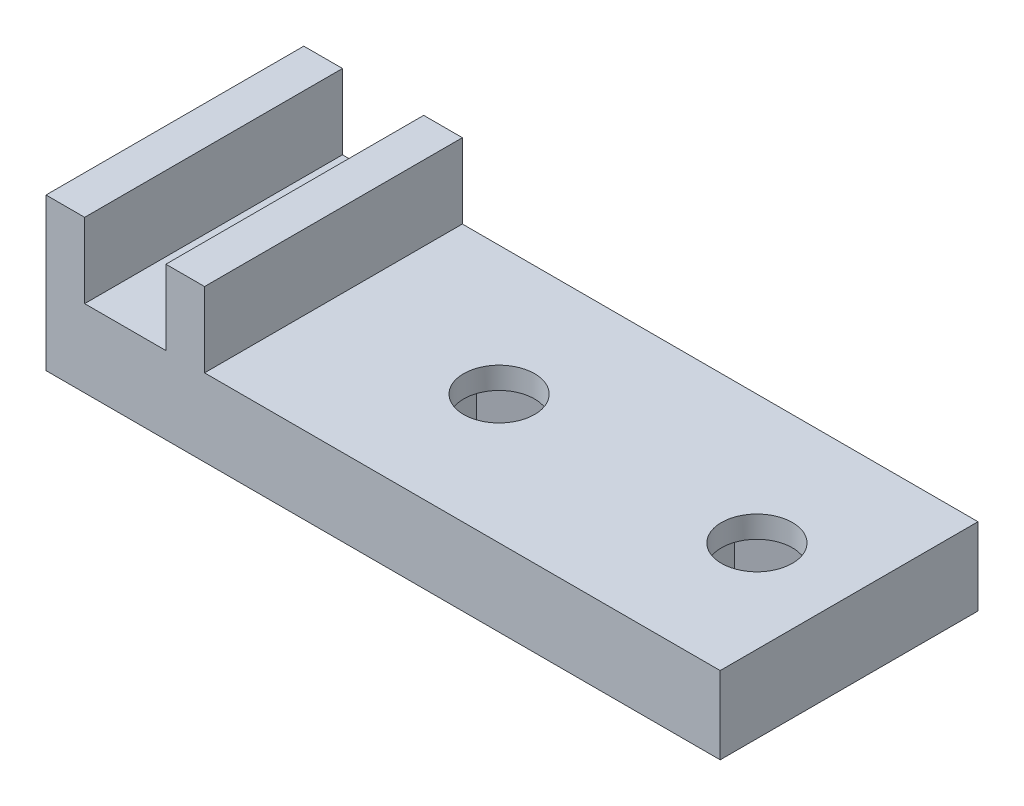
ISO-10303-21;
HEADER;
FILE_DESCRIPTION(('STEP AP214'),'2;1');
FILE_NAME('part.step','',(''),(''),'','','');
FILE_SCHEMA(('AUTOMOTIVE_DESIGN { 1 0 10303 214 1 1 1 1 }'));
ENDSEC;
DATA;
#1=APPLICATION_CONTEXT('core data for automotive mechanical design processes');
#2=APPLICATION_PROTOCOL_DEFINITION('international standard','automotive_design',2000,#1);
#3=PRODUCT_CONTEXT('',#1,'mechanical');
#4=PRODUCT('Part','Part','',(#3));
#5=PRODUCT_RELATED_PRODUCT_CATEGORY('part','',(#4));
#6=PRODUCT_DEFINITION_FORMATION('','',#4);
#7=PRODUCT_DEFINITION_CONTEXT('part definition',#1,'design');
#8=PRODUCT_DEFINITION('design','',#6,#7);
#9=PRODUCT_DEFINITION_SHAPE('','',#8);
#10=(LENGTH_UNIT() NAMED_UNIT(*) SI_UNIT(.MILLI.,.METRE.));
#11=(NAMED_UNIT(*) PLANE_ANGLE_UNIT() SI_UNIT($,.RADIAN.));
#12=(NAMED_UNIT(*) SI_UNIT($,.STERADIAN.) SOLID_ANGLE_UNIT());
#13=UNCERTAINTY_MEASURE_WITH_UNIT(LENGTH_MEASURE(1.E-05),#10,'distance_accuracy_value','');
#14=(GEOMETRIC_REPRESENTATION_CONTEXT(3) GLOBAL_UNCERTAINTY_ASSIGNED_CONTEXT((#13)) GLOBAL_UNIT_ASSIGNED_CONTEXT((#10,
#11,#12)) REPRESENTATION_CONTEXT('',''));
#15=CARTESIAN_POINT('',(0.,0.,0.));
#16=DIRECTION('',(0.,0.,1.));
#17=DIRECTION('',(1.,0.,0.));
#18=AXIS2_PLACEMENT_3D('',#15,#16,#17);
#19=CARTESIAN_POINT('',(-3.15,5.8,20.));
#20=DIRECTION('',(1.,0.,0.));
#21=DIRECTION('',(0.,0.,-1.));
#22=AXIS2_PLACEMENT_3D('',#19,#20,#21);
#23=PLANE('',#22);
#24=DIRECTION('',(0.,-1.,0.));
#25=VECTOR('',#24,1.);
#26=CARTESIAN_POINT('',(-3.15,5.8,0.));
#27=LINE('',#26,#25);
#28=CARTESIAN_POINT('',(-3.15,5.8,0.));
#29=VERTEX_POINT('',#28);
#30=CARTESIAN_POINT('',(-3.15,-6.,0.));
#31=VERTEX_POINT('',#30);
#32=EDGE_CURVE('E316',#29,#31,#27,.T.);
#33=ORIENTED_EDGE('',*,*,#32,.T.);
#34=DIRECTION('',(0.,0.,-1.));
#35=VECTOR('',#34,1.);
#36=CARTESIAN_POINT('',(-3.15,-6.,20.));
#37=LINE('',#36,#35);
#38=CARTESIAN_POINT('',(-3.15,-6.,20.));
#39=VERTEX_POINT('',#38);
#40=EDGE_CURVE('E11',#39,#31,#37,.T.);
#41=ORIENTED_EDGE('',*,*,#40,.F.);
#42=DIRECTION('',(0.,-1.,0.));
#43=VECTOR('',#42,1.);
#44=CARTESIAN_POINT('',(-3.15,5.8,20.));
#45=LINE('',#44,#43);
#46=CARTESIAN_POINT('',(-3.15,5.8,20.));
#47=VERTEX_POINT('',#46);
#48=EDGE_CURVE('E293',#47,#39,#45,.T.);
#49=ORIENTED_EDGE('',*,*,#48,.F.);
#50=DIRECTION('',(0.,0.,-1.));
#51=VECTOR('',#50,1.);
#52=CARTESIAN_POINT('',(-3.15,5.8,20.));
#53=LINE('',#52,#51);
#54=EDGE_CURVE('E315',#47,#29,#53,.T.);
#55=ORIENTED_EDGE('',*,*,#54,.T.);
#56=EDGE_LOOP('',(#33,#41,#49,#55));
#57=FACE_BOUND('',#56,.T.);
#58=ADVANCED_FACE('F41',(#57),#23,.F.);
#59=CARTESIAN_POINT('',(-3.15,-6.,20.));
#60=DIRECTION('',(0.,1.,0.));
#61=DIRECTION('',(0.,0.,1.));
#62=AXIS2_PLACEMENT_3D('',#59,#60,#61);
#63=PLANE('',#62);
#64=DIRECTION('',(0.,0.,-1.));
#65=VECTOR('',#64,1.);
#66=CARTESIAN_POINT('',(17.85,-6.,7.60399638286305));
#67=LINE('',#66,#65);
#68=CARTESIAN_POINT('',(17.85,-6.,12.3960036171369));
#69=VERTEX_POINT('',#68);
#70=CARTESIAN_POINT('',(17.85,-6.,7.60399638286305));
#71=VERTEX_POINT('',#70);
#72=EDGE_CURVE('E227',#69,#71,#67,.T.);
#73=ORIENTED_EDGE('',*,*,#72,.F.);
#74=DIRECTION('',(-0.866025403784439,0.,-0.5));
#75=VECTOR('',#74,1.);
#76=CARTESIAN_POINT('',(17.85,-6.,12.3960036171369));
#77=LINE('',#76,#75);
#78=CARTESIAN_POINT('',(22.,-6.,14.7920072342739));
#79=VERTEX_POINT('',#78);
#80=EDGE_CURVE('E57',#79,#69,#77,.T.);
#81=ORIENTED_EDGE('',*,*,#80,.F.);
#82=DIRECTION('',(-0.866025403784439,0.,0.5));
#83=VECTOR('',#82,1.);
#84=CARTESIAN_POINT('',(22.,-6.,14.7920072342739));
#85=LINE('',#84,#83);
#86=CARTESIAN_POINT('',(26.15,-6.,12.3960036171369));
#87=VERTEX_POINT('',#86);
#88=EDGE_CURVE('E213',#87,#79,#85,.T.);
#89=ORIENTED_EDGE('',*,*,#88,.F.);
#90=DIRECTION('',(0.,0.,1.));
#91=VECTOR('',#90,1.);
#92=CARTESIAN_POINT('',(26.15,-6.,12.3960036171369));
#93=LINE('',#92,#91);
#94=CARTESIAN_POINT('',(26.15,-6.,7.60399638286305));
#95=VERTEX_POINT('',#94);
#96=EDGE_CURVE('E216',#95,#87,#93,.T.);
#97=ORIENTED_EDGE('',*,*,#96,.F.);
#98=DIRECTION('',(0.866025403784439,0.,0.5));
#99=VECTOR('',#98,1.);
#100=CARTESIAN_POINT('',(26.15,-6.,7.60399638286305));
#101=LINE('',#100,#99);
#102=CARTESIAN_POINT('',(22.,-6.,5.20799276572611));
#103=VERTEX_POINT('',#102);
#104=EDGE_CURVE('E232',#103,#95,#101,.T.);
#105=ORIENTED_EDGE('',*,*,#104,.F.);
#106=DIRECTION('',(0.866025403784439,0.,-0.5));
#107=VECTOR('',#106,1.);
#108=CARTESIAN_POINT('',(22.,-6.,5.20799276572611));
#109=LINE('',#108,#107);
#110=EDGE_CURVE('E229',#71,#103,#109,.T.);
#111=ORIENTED_EDGE('',*,*,#110,.F.);
#112=EDGE_LOOP('',(#73,#81,#89,#97,#105,#111));
#113=FACE_BOUND('',#112,.T.);
#114=DIRECTION('',(0.,0.,-1.));
#115=VECTOR('',#114,1.);
#116=CARTESIAN_POINT('',(37.85,-6.,7.60399638286305));
#117=LINE('',#116,#115);
#118=CARTESIAN_POINT('',(37.85,-6.,12.3960036171369));
#119=VERTEX_POINT('',#118);
#120=CARTESIAN_POINT('',(37.85,-6.,7.60399638286305));
#121=VERTEX_POINT('',#120);
#122=EDGE_CURVE('E273',#119,#121,#117,.T.);
#123=ORIENTED_EDGE('',*,*,#122,.F.);
#124=DIRECTION('',(-0.866025403784439,0.,-0.5));
#125=VECTOR('',#124,1.);
#126=CARTESIAN_POINT('',(37.85,-6.,12.3960036171369));
#127=LINE('',#126,#125);
#128=CARTESIAN_POINT('',(42.,-6.,14.7920072342739));
#129=VERTEX_POINT('',#128);
#130=EDGE_CURVE('E65',#129,#119,#127,.T.);
#131=ORIENTED_EDGE('',*,*,#130,.F.);
#132=DIRECTION('',(-0.866025403784439,0.,0.5));
#133=VECTOR('',#132,1.);
#134=CARTESIAN_POINT('',(42.,-6.,14.7920072342739));
#135=LINE('',#134,#133);
#136=CARTESIAN_POINT('',(46.15,-6.,12.3960036171369));
#137=VERTEX_POINT('',#136);
#138=EDGE_CURVE('E260',#137,#129,#135,.T.);
#139=ORIENTED_EDGE('',*,*,#138,.F.);
#140=DIRECTION('',(0.,0.,1.));
#141=VECTOR('',#140,1.);
#142=CARTESIAN_POINT('',(46.15,-6.,12.3960036171369));
#143=LINE('',#142,#141);
#144=CARTESIAN_POINT('',(46.15,-6.,7.60399638286305));
#145=VERTEX_POINT('',#144);
#146=EDGE_CURVE('E263',#145,#137,#143,.T.);
#147=ORIENTED_EDGE('',*,*,#146,.F.);
#148=DIRECTION('',(0.866025403784439,0.,0.5));
#149=VECTOR('',#148,1.);
#150=CARTESIAN_POINT('',(46.15,-6.,7.60399638286305));
#151=LINE('',#150,#149);
#152=CARTESIAN_POINT('',(42.,-6.,5.20799276572611));
#153=VERTEX_POINT('',#152);
#154=EDGE_CURVE('E267',#153,#145,#151,.T.);
#155=ORIENTED_EDGE('',*,*,#154,.F.);
#156=DIRECTION('',(0.866025403784439,0.,-0.5));
#157=VECTOR('',#156,1.);
#158=CARTESIAN_POINT('',(42.,-6.,5.20799276572611));
#159=LINE('',#158,#157);
#160=EDGE_CURVE('E270',#121,#153,#159,.T.);
#161=ORIENTED_EDGE('',*,*,#160,.F.);
#162=EDGE_LOOP('',(#123,#131,#139,#147,#155,#161));
#163=FACE_BOUND('',#162,.T.);
#164=DIRECTION('',(1.,0.,0.));
#165=VECTOR('',#164,1.);
#166=CARTESIAN_POINT('',(-3.15,-6.,0.));
#167=LINE('',#166,#165);
#168=CARTESIAN_POINT('',(49.15,-6.,0.));
#169=VERTEX_POINT('',#168);
#170=EDGE_CURVE('E319',#31,#169,#167,.T.);
#171=ORIENTED_EDGE('',*,*,#170,.T.);
#172=DIRECTION('',(0.,0.,-1.));
#173=VECTOR('',#172,1.);
#174=CARTESIAN_POINT('',(49.15,-6.,20.));
#175=LINE('',#174,#173);
#176=CARTESIAN_POINT('',(49.15,-6.,20.));
#177=VERTEX_POINT('',#176);
#178=EDGE_CURVE('E49',#177,#169,#175,.T.);
#179=ORIENTED_EDGE('',*,*,#178,.F.);
#180=DIRECTION('',(1.,0.,0.));
#181=VECTOR('',#180,1.);
#182=CARTESIAN_POINT('',(-3.15,-6.,20.));
#183=LINE('',#182,#181);
#184=EDGE_CURVE('E296',#39,#177,#183,.T.);
#185=ORIENTED_EDGE('',*,*,#184,.F.);
#186=ORIENTED_EDGE('',*,*,#40,.T.);
#187=EDGE_LOOP('',(#171,#179,#185,#186));
#188=FACE_BOUND('',#187,.T.);
#189=ADVANCED_FACE('F391',(#113,#163,#188),#63,.F.);
#190=CARTESIAN_POINT('',(49.15,-6.,20.));
#191=DIRECTION('',(-1.,0.,0.));
#192=DIRECTION('',(0.,0.,1.));
#193=AXIS2_PLACEMENT_3D('',#190,#191,#192);
#194=PLANE('',#193);
#195=DIRECTION('',(0.,1.,0.));
#196=VECTOR('',#195,1.);
#197=CARTESIAN_POINT('',(49.15,-6.,0.));
#198=LINE('',#197,#196);
#199=CARTESIAN_POINT('',(49.15,0.,0.));
#200=VERTEX_POINT('',#199);
#201=EDGE_CURVE('E322',#169,#200,#198,.T.);
#202=ORIENTED_EDGE('',*,*,#201,.T.);
#203=DIRECTION('',(0.,0.,-1.));
#204=VECTOR('',#203,1.);
#205=CARTESIAN_POINT('',(49.15,0.,20.));
#206=LINE('',#205,#204);
#207=CARTESIAN_POINT('',(49.15,0.,20.));
#208=VERTEX_POINT('',#207);
#209=EDGE_CURVE('E357',#208,#200,#206,.T.);
#210=ORIENTED_EDGE('',*,*,#209,.F.);
#211=DIRECTION('',(0.,1.,0.));
#212=VECTOR('',#211,1.);
#213=CARTESIAN_POINT('',(49.15,-6.,20.));
#214=LINE('',#213,#212);
#215=EDGE_CURVE('E299',#177,#208,#214,.T.);
#216=ORIENTED_EDGE('',*,*,#215,.F.);
#217=ORIENTED_EDGE('',*,*,#178,.T.);
#218=EDGE_LOOP('',(#202,#210,#216,#217));
#219=FACE_BOUND('',#218,.T.);
#220=ADVANCED_FACE('F397',(#219),#194,.F.);
#221=CARTESIAN_POINT('',(49.15,0.,20.));
#222=DIRECTION('',(0.,-1.,0.));
#223=DIRECTION('',(0.,0.,-1.));
#224=AXIS2_PLACEMENT_3D('',#221,#222,#223);
#225=PLANE('',#224);
#226=CARTESIAN_POINT('',(22.,0.,10.));
#227=DIRECTION('',(0.,-1.,0.));
#228=DIRECTION('',(0.,0.,-1.));
#229=AXIS2_PLACEMENT_3D('',#226,#227,#228);
#230=CIRCLE('',#229,2.75);
#231=CARTESIAN_POINT('',(22.,0.,7.25));
#232=VERTEX_POINT('',#231);
#233=EDGE_CURVE('E320',#232,#232,#230,.T.);
#234=ORIENTED_EDGE('',*,*,#233,.T.);
#235=EDGE_LOOP('',(#234));
#236=FACE_BOUND('',#235,.T.);
#237=CARTESIAN_POINT('',(42.,0.,10.));
#238=DIRECTION('',(0.,-1.,0.));
#239=DIRECTION('',(0.,0.,-1.));
#240=AXIS2_PLACEMENT_3D('',#237,#238,#239);
#241=CIRCLE('',#240,2.75);
#242=CARTESIAN_POINT('',(42.,0.,7.25));
#243=VERTEX_POINT('',#242);
#244=EDGE_CURVE('E362',#243,#243,#241,.T.);
#245=ORIENTED_EDGE('',*,*,#244,.T.);
#246=EDGE_LOOP('',(#245));
#247=FACE_BOUND('',#246,.T.);
#248=DIRECTION('',(-1.,0.,0.));
#249=VECTOR('',#248,1.);
#250=CARTESIAN_POINT('',(49.15,0.,0.));
#251=LINE('',#250,#249);
#252=CARTESIAN_POINT('',(9.15,0.,0.));
#253=VERTEX_POINT('',#252);
#254=EDGE_CURVE('E324',#200,#253,#251,.T.);
#255=ORIENTED_EDGE('',*,*,#254,.T.);
#256=DIRECTION('',(0.,0.,-1.));
#257=VECTOR('',#256,1.);
#258=CARTESIAN_POINT('',(9.15,0.,20.));
#259=LINE('',#258,#257);
#260=CARTESIAN_POINT('',(9.15,0.,20.));
#261=VERTEX_POINT('',#260);
#262=EDGE_CURVE('E354',#261,#253,#259,.T.);
#263=ORIENTED_EDGE('',*,*,#262,.F.);
#264=DIRECTION('',(-1.,0.,0.));
#265=VECTOR('',#264,1.);
#266=CARTESIAN_POINT('',(49.15,0.,20.));
#267=LINE('',#266,#265);
#268=EDGE_CURVE('E301',#208,#261,#267,.T.);
#269=ORIENTED_EDGE('',*,*,#268,.F.);
#270=ORIENTED_EDGE('',*,*,#209,.T.);
#271=EDGE_LOOP('',(#255,#263,#269,#270));
#272=FACE_BOUND('',#271,.T.);
#273=ADVANCED_FACE('F444',(#236,#247,#272),#225,.F.);
#274=CARTESIAN_POINT('',(9.15,0.,20.));
#275=DIRECTION('',(-1.,0.,0.));
#276=DIRECTION('',(0.,0.,1.));
#277=AXIS2_PLACEMENT_3D('',#274,#275,#276);
#278=PLANE('',#277);
#279=DIRECTION('',(0.,1.,0.));
#280=VECTOR('',#279,1.);
#281=CARTESIAN_POINT('',(9.15,0.,0.));
#282=LINE('',#281,#280);
#283=CARTESIAN_POINT('',(9.15,5.8,0.));
#284=VERTEX_POINT('',#283);
#285=EDGE_CURVE('E326',#253,#284,#282,.T.);
#286=ORIENTED_EDGE('',*,*,#285,.T.);
#287=DIRECTION('',(0.,0.,-1.));
#288=VECTOR('',#287,1.);
#289=CARTESIAN_POINT('',(9.15,5.8,20.));
#290=LINE('',#289,#288);
#291=CARTESIAN_POINT('',(9.15,5.8,20.));
#292=VERTEX_POINT('',#291);
#293=EDGE_CURVE('E351',#292,#284,#290,.T.);
#294=ORIENTED_EDGE('',*,*,#293,.F.);
#295=DIRECTION('',(0.,1.,0.));
#296=VECTOR('',#295,1.);
#297=CARTESIAN_POINT('',(9.15,0.,20.));
#298=LINE('',#297,#296);
#299=EDGE_CURVE('E303',#261,#292,#298,.T.);
#300=ORIENTED_EDGE('',*,*,#299,.F.);
#301=ORIENTED_EDGE('',*,*,#262,.T.);
#302=EDGE_LOOP('',(#286,#294,#300,#301));
#303=FACE_BOUND('',#302,.T.);
#304=ADVANCED_FACE('F439',(#303),#278,.F.);
#305=CARTESIAN_POINT('',(9.15,5.8,20.));
#306=DIRECTION('',(0.,-1.,0.));
#307=DIRECTION('',(0.,0.,-1.));
#308=AXIS2_PLACEMENT_3D('',#305,#306,#307);
#309=PLANE('',#308);
#310=DIRECTION('',(-1.,0.,0.));
#311=VECTOR('',#310,1.);
#312=CARTESIAN_POINT('',(9.15,5.8,0.));
#313=LINE('',#312,#311);
#314=CARTESIAN_POINT('',(6.15,5.8,0.));
#315=VERTEX_POINT('',#314);
#316=EDGE_CURVE('E328',#284,#315,#313,.T.);
#317=ORIENTED_EDGE('',*,*,#316,.T.);
#318=DIRECTION('',(0.,0.,-1.));
#319=VECTOR('',#318,1.);
#320=CARTESIAN_POINT('',(6.15,5.8,20.));
#321=LINE('',#320,#319);
#322=CARTESIAN_POINT('',(6.15,5.8,20.));
#323=VERTEX_POINT('',#322);
#324=EDGE_CURVE('E348',#323,#315,#321,.T.);
#325=ORIENTED_EDGE('',*,*,#324,.F.);
#326=DIRECTION('',(-1.,0.,0.));
#327=VECTOR('',#326,1.);
#328=CARTESIAN_POINT('',(9.15,5.8,20.));
#329=LINE('',#328,#327);
#330=EDGE_CURVE('E305',#292,#323,#329,.T.);
#331=ORIENTED_EDGE('',*,*,#330,.F.);
#332=ORIENTED_EDGE('',*,*,#293,.T.);
#333=EDGE_LOOP('',(#317,#325,#331,#332));
#334=FACE_BOUND('',#333,.T.);
#335=ADVANCED_FACE('F435',(#334),#309,.F.);
#336=CARTESIAN_POINT('',(6.15,5.8,20.));
#337=DIRECTION('',(1.,0.,0.));
#338=DIRECTION('',(0.,0.,-1.));
#339=AXIS2_PLACEMENT_3D('',#336,#337,#338);
#340=PLANE('',#339);
#341=DIRECTION('',(0.,-1.,0.));
#342=VECTOR('',#341,1.);
#343=CARTESIAN_POINT('',(6.15,5.8,0.));
#344=LINE('',#343,#342);
#345=CARTESIAN_POINT('',(6.15,0.,0.));
#346=VERTEX_POINT('',#345);
#347=EDGE_CURVE('E330',#315,#346,#344,.T.);
#348=ORIENTED_EDGE('',*,*,#347,.T.);
#349=DIRECTION('',(0.,0.,-1.));
#350=VECTOR('',#349,1.);
#351=CARTESIAN_POINT('',(6.15,0.,20.));
#352=LINE('',#351,#350);
#353=CARTESIAN_POINT('',(6.15,0.,20.));
#354=VERTEX_POINT('',#353);
#355=EDGE_CURVE('E345',#354,#346,#352,.T.);
#356=ORIENTED_EDGE('',*,*,#355,.F.);
#357=DIRECTION('',(0.,-1.,0.));
#358=VECTOR('',#357,1.);
#359=CARTESIAN_POINT('',(6.15,5.8,20.));
#360=LINE('',#359,#358);
#361=EDGE_CURVE('E307',#323,#354,#360,.T.);
#362=ORIENTED_EDGE('',*,*,#361,.F.);
#363=ORIENTED_EDGE('',*,*,#324,.T.);
#364=EDGE_LOOP('',(#348,#356,#362,#363));
#365=FACE_BOUND('',#364,.T.);
#366=ADVANCED_FACE('F431',(#365),#340,.F.);
#367=CARTESIAN_POINT('',(6.15,0.,20.));
#368=DIRECTION('',(0.,-1.,0.));
#369=DIRECTION('',(0.,0.,-1.));
#370=AXIS2_PLACEMENT_3D('',#367,#368,#369);
#371=PLANE('',#370);
#372=DIRECTION('',(-1.,0.,0.));
#373=VECTOR('',#372,1.);
#374=CARTESIAN_POINT('',(6.15,0.,0.));
#375=LINE('',#374,#373);
#376=CARTESIAN_POINT('',(-0.15,0.,0.));
#377=VERTEX_POINT('',#376);
#378=EDGE_CURVE('E332',#346,#377,#375,.T.);
#379=ORIENTED_EDGE('',*,*,#378,.T.);
#380=DIRECTION('',(0.,0.,-1.));
#381=VECTOR('',#380,1.);
#382=CARTESIAN_POINT('',(-0.15,0.,20.));
#383=LINE('',#382,#381);
#384=CARTESIAN_POINT('',(-0.15,0.,20.));
#385=VERTEX_POINT('',#384);
#386=EDGE_CURVE('E342',#385,#377,#383,.T.);
#387=ORIENTED_EDGE('',*,*,#386,.F.);
#388=DIRECTION('',(-1.,0.,0.));
#389=VECTOR('',#388,1.);
#390=CARTESIAN_POINT('',(6.15,0.,20.));
#391=LINE('',#390,#389);
#392=EDGE_CURVE('E309',#354,#385,#391,.T.);
#393=ORIENTED_EDGE('',*,*,#392,.F.);
#394=ORIENTED_EDGE('',*,*,#355,.T.);
#395=EDGE_LOOP('',(#379,#387,#393,#394));
#396=FACE_BOUND('',#395,.T.);
#397=ADVANCED_FACE('F426',(#396),#371,.F.);
#398=CARTESIAN_POINT('',(-0.15,0.,20.));
#399=DIRECTION('',(-1.,0.,0.));
#400=DIRECTION('',(0.,0.,1.));
#401=AXIS2_PLACEMENT_3D('',#398,#399,#400);
#402=PLANE('',#401);
#403=DIRECTION('',(0.,1.,0.));
#404=VECTOR('',#403,1.);
#405=CARTESIAN_POINT('',(-0.15,0.,0.));
#406=LINE('',#405,#404);
#407=CARTESIAN_POINT('',(-0.15,5.8,0.));
#408=VERTEX_POINT('',#407);
#409=EDGE_CURVE('E334',#377,#408,#406,.T.);
#410=ORIENTED_EDGE('',*,*,#409,.T.);
#411=DIRECTION('',(0.,0.,-1.));
#412=VECTOR('',#411,1.);
#413=CARTESIAN_POINT('',(-0.15,5.8,20.));
#414=LINE('',#413,#412);
#415=CARTESIAN_POINT('',(-0.15,5.8,20.));
#416=VERTEX_POINT('',#415);
#417=EDGE_CURVE('E339',#416,#408,#414,.T.);
#418=ORIENTED_EDGE('',*,*,#417,.F.);
#419=DIRECTION('',(0.,1.,0.));
#420=VECTOR('',#419,1.);
#421=CARTESIAN_POINT('',(-0.15,0.,20.));
#422=LINE('',#421,#420);
#423=EDGE_CURVE('E311',#385,#416,#422,.T.);
#424=ORIENTED_EDGE('',*,*,#423,.F.);
#425=ORIENTED_EDGE('',*,*,#386,.T.);
#426=EDGE_LOOP('',(#410,#418,#424,#425));
#427=FACE_BOUND('',#426,.T.);
#428=ADVANCED_FACE('F420',(#427),#402,.F.);
#429=CARTESIAN_POINT('',(-0.15,5.8,20.));
#430=DIRECTION('',(0.,-1.,0.));
#431=DIRECTION('',(0.,0.,-1.));
#432=AXIS2_PLACEMENT_3D('',#429,#430,#431);
#433=PLANE('',#432);
#434=DIRECTION('',(-1.,0.,0.));
#435=VECTOR('',#434,1.);
#436=CARTESIAN_POINT('',(-0.15,5.8,0.));
#437=LINE('',#436,#435);
#438=EDGE_CURVE('E297',#408,#29,#437,.T.);
#439=ORIENTED_EDGE('',*,*,#438,.T.);
#440=ORIENTED_EDGE('',*,*,#54,.F.);
#441=DIRECTION('',(-1.,0.,0.));
#442=VECTOR('',#441,1.);
#443=CARTESIAN_POINT('',(-0.15,5.8,20.));
#444=LINE('',#443,#442);
#445=EDGE_CURVE('E313',#416,#47,#444,.T.);
#446=ORIENTED_EDGE('',*,*,#445,.F.);
#447=ORIENTED_EDGE('',*,*,#417,.T.);
#448=EDGE_LOOP('',(#439,#440,#446,#447));
#449=FACE_BOUND('',#448,.T.);
#450=ADVANCED_FACE('F418',(#449),#433,.F.);
#451=CARTESIAN_POINT('',(0.,0.,20.));
#452=DIRECTION('',(0.,0.,1.));
#453=DIRECTION('',(1.,0.,0.));
#454=AXIS2_PLACEMENT_3D('',#451,#452,#453);
#455=PLANE('',#454);
#456=ORIENTED_EDGE('',*,*,#48,.T.);
#457=ORIENTED_EDGE('',*,*,#184,.T.);
#458=ORIENTED_EDGE('',*,*,#215,.T.);
#459=ORIENTED_EDGE('',*,*,#268,.T.);
#460=ORIENTED_EDGE('',*,*,#299,.T.);
#461=ORIENTED_EDGE('',*,*,#330,.T.);
#462=ORIENTED_EDGE('',*,*,#361,.T.);
#463=ORIENTED_EDGE('',*,*,#392,.T.);
#464=ORIENTED_EDGE('',*,*,#423,.T.);
#465=ORIENTED_EDGE('',*,*,#445,.T.);
#466=EDGE_LOOP('',(#456,#457,#458,#459,#460,#461,#462,#463,#464,#465));
#467=FACE_BOUND('',#466,.T.);
#468=ADVANCED_FACE('F413',(#467),#455,.T.);
#469=CARTESIAN_POINT('',(0.,0.,0.));
#470=DIRECTION('',(0.,0.,1.));
#471=DIRECTION('',(1.,0.,0.));
#472=AXIS2_PLACEMENT_3D('',#469,#470,#471);
#473=PLANE('',#472);
#474=ORIENTED_EDGE('',*,*,#32,.F.);
#475=ORIENTED_EDGE('',*,*,#438,.F.);
#476=ORIENTED_EDGE('',*,*,#409,.F.);
#477=ORIENTED_EDGE('',*,*,#378,.F.);
#478=ORIENTED_EDGE('',*,*,#347,.F.);
#479=ORIENTED_EDGE('',*,*,#316,.F.);
#480=ORIENTED_EDGE('',*,*,#285,.F.);
#481=ORIENTED_EDGE('',*,*,#254,.F.);
#482=ORIENTED_EDGE('',*,*,#201,.F.);
#483=ORIENTED_EDGE('',*,*,#170,.F.);
#484=EDGE_LOOP('',(#474,#475,#476,#477,#478,#479,#480,#481,#482,#483));
#485=FACE_BOUND('',#484,.T.);
#486=ADVANCED_FACE('F405',(#485),#473,.F.);
#487=CARTESIAN_POINT('',(42.,-6.,10.));
#488=DIRECTION('',(0.,1.,0.));
#489=DIRECTION('',(0.,0.,1.));
#490=AXIS2_PLACEMENT_3D('',#487,#488,#489);
#491=CYLINDRICAL_SURFACE('',#490,2.75);
#492=CARTESIAN_POINT('',(42.,-1.7,10.));
#493=DIRECTION('',(0.,1.,0.));
#494=DIRECTION('',(0.,0.,1.));
#495=AXIS2_PLACEMENT_3D('',#492,#493,#494);
#496=CIRCLE('',#495,2.75);
#497=CARTESIAN_POINT('',(42.,-1.7,12.75));
#498=VERTEX_POINT('',#497);
#499=EDGE_CURVE('E44',#498,#498,#496,.F.);
#500=ORIENTED_EDGE('',*,*,#499,.T.);
#501=EDGE_LOOP('',(#500));
#502=FACE_BOUND('',#501,.T.);
#503=ORIENTED_EDGE('',*,*,#244,.F.);
#504=EDGE_LOOP('',(#503));
#505=FACE_BOUND('',#504,.T.);
#506=ADVANCED_FACE('F372',(#502,#505),#491,.F.);
#507=CARTESIAN_POINT('',(22.,-6.,10.));
#508=DIRECTION('',(0.,1.,0.));
#509=DIRECTION('',(0.,0.,1.));
#510=AXIS2_PLACEMENT_3D('',#507,#508,#509);
#511=CYLINDRICAL_SURFACE('',#510,2.75);
#512=CARTESIAN_POINT('',(22.,-1.7,10.));
#513=DIRECTION('',(0.,1.,0.));
#514=DIRECTION('',(0.,0.,1.));
#515=AXIS2_PLACEMENT_3D('',#512,#513,#514);
#516=CIRCLE('',#515,2.75);
#517=CARTESIAN_POINT('',(22.,-1.7,12.75));
#518=VERTEX_POINT('',#517);
#519=EDGE_CURVE('E239',#518,#518,#516,.F.);
#520=ORIENTED_EDGE('',*,*,#519,.T.);
#521=EDGE_LOOP('',(#520));
#522=FACE_BOUND('',#521,.T.);
#523=ORIENTED_EDGE('',*,*,#233,.F.);
#524=EDGE_LOOP('',(#523));
#525=FACE_BOUND('',#524,.T.);
#526=ADVANCED_FACE('F471',(#522,#525),#511,.F.);
#527=CARTESIAN_POINT('',(0.,-1.7,0.));
#528=DIRECTION('',(0.,1.,0.));
#529=DIRECTION('',(0.,0.,1.));
#530=AXIS2_PLACEMENT_3D('',#527,#528,#529);
#531=PLANE('',#530);
#532=DIRECTION('',(-0.866025403784439,0.,-0.5));
#533=VECTOR('',#532,1.);
#534=CARTESIAN_POINT('',(17.85,-1.7,12.3960036171369));
#535=LINE('',#534,#533);
#536=CARTESIAN_POINT('',(22.,-1.7,14.7920072342739));
#537=VERTEX_POINT('',#536);
#538=CARTESIAN_POINT('',(17.85,-1.7,12.3960036171369));
#539=VERTEX_POINT('',#538);
#540=EDGE_CURVE('E193',#537,#539,#535,.T.);
#541=ORIENTED_EDGE('',*,*,#540,.T.);
#542=DIRECTION('',(0.,0.,-1.));
#543=VECTOR('',#542,1.);
#544=CARTESIAN_POINT('',(17.85,-1.7,7.60399638286305));
#545=LINE('',#544,#543);
#546=CARTESIAN_POINT('',(17.85,-1.7,7.60399638286305));
#547=VERTEX_POINT('',#546);
#548=EDGE_CURVE('E202',#539,#547,#545,.T.);
#549=ORIENTED_EDGE('',*,*,#548,.T.);
#550=DIRECTION('',(0.866025403784439,0.,-0.5));
#551=VECTOR('',#550,1.);
#552=CARTESIAN_POINT('',(22.,-1.7,5.20799276572611));
#553=LINE('',#552,#551);
#554=CARTESIAN_POINT('',(22.,-1.7,5.20799276572611));
#555=VERTEX_POINT('',#554);
#556=EDGE_CURVE('E207',#547,#555,#553,.T.);
#557=ORIENTED_EDGE('',*,*,#556,.T.);
#558=DIRECTION('',(0.866025403784439,0.,0.5));
#559=VECTOR('',#558,1.);
#560=CARTESIAN_POINT('',(26.15,-1.7,7.60399638286305));
#561=LINE('',#560,#559);
#562=CARTESIAN_POINT('',(26.15,-1.7,7.60399638286305));
#563=VERTEX_POINT('',#562);
#564=EDGE_CURVE('E220',#555,#563,#561,.T.);
#565=ORIENTED_EDGE('',*,*,#564,.T.);
#566=DIRECTION('',(0.,0.,1.));
#567=VECTOR('',#566,1.);
#568=CARTESIAN_POINT('',(26.15,-1.7,12.3960036171369));
#569=LINE('',#568,#567);
#570=CARTESIAN_POINT('',(26.15,-1.7,12.3960036171369));
#571=VERTEX_POINT('',#570);
#572=EDGE_CURVE('E223',#563,#571,#569,.T.);
#573=ORIENTED_EDGE('',*,*,#572,.T.);
#574=DIRECTION('',(-0.866025403784439,0.,0.5));
#575=VECTOR('',#574,1.);
#576=CARTESIAN_POINT('',(22.,-1.7,14.7920072342739));
#577=LINE('',#576,#575);
#578=EDGE_CURVE('E199',#571,#537,#577,.T.);
#579=ORIENTED_EDGE('',*,*,#578,.T.);
#580=EDGE_LOOP('',(#541,#549,#557,#565,#573,#579));
#581=FACE_BOUND('',#580,.T.);
#582=ORIENTED_EDGE('',*,*,#519,.F.);
#583=EDGE_LOOP('',(#582));
#584=FACE_BOUND('',#583,.T.);
#585=ADVANCED_FACE('F209',(#581,#584),#531,.F.);
#586=CARTESIAN_POINT('',(17.85,-1.7,12.3960036171369));
#587=DIRECTION('',(-0.5,0.,0.866025403784439));
#588=DIRECTION('',(0.866025403784439,0.,0.5));
#589=AXIS2_PLACEMENT_3D('',#586,#587,#588);
#590=PLANE('',#589);
#591=ORIENTED_EDGE('',*,*,#80,.T.);
#592=DIRECTION('',(0.,-1.,0.));
#593=VECTOR('',#592,1.);
#594=CARTESIAN_POINT('',(17.85,-1.7,12.3960036171369));
#595=LINE('',#594,#593);
#596=EDGE_CURVE('E189',#539,#69,#595,.T.);
#597=ORIENTED_EDGE('',*,*,#596,.F.);
#598=ORIENTED_EDGE('',*,*,#540,.F.);
#599=DIRECTION('',(0.,-1.,0.));
#600=VECTOR('',#599,1.);
#601=CARTESIAN_POINT('',(22.,-1.7,14.7920072342739));
#602=LINE('',#601,#600);
#603=EDGE_CURVE('E237',#537,#79,#602,.T.);
#604=ORIENTED_EDGE('',*,*,#603,.T.);
#605=EDGE_LOOP('',(#591,#597,#598,#604));
#606=FACE_BOUND('',#605,.T.);
#607=ADVANCED_FACE('F191',(#606),#590,.F.);
#608=CARTESIAN_POINT('',(22.,-1.7,14.7920072342739));
#609=DIRECTION('',(0.5,0.,0.866025403784439));
#610=DIRECTION('',(0.866025403784439,0.,-0.5));
#611=AXIS2_PLACEMENT_3D('',#608,#609,#610);
#612=PLANE('',#611);
#613=ORIENTED_EDGE('',*,*,#88,.T.);
#614=ORIENTED_EDGE('',*,*,#603,.F.);
#615=ORIENTED_EDGE('',*,*,#578,.F.);
#616=DIRECTION('',(0.,-1.,0.));
#617=VECTOR('',#616,1.);
#618=CARTESIAN_POINT('',(26.15,-1.7,12.3960036171369));
#619=LINE('',#618,#617);
#620=EDGE_CURVE('E240',#571,#87,#619,.T.);
#621=ORIENTED_EDGE('',*,*,#620,.T.);
#622=EDGE_LOOP('',(#613,#614,#615,#621));
#623=FACE_BOUND('',#622,.T.);
#624=ADVANCED_FACE('F484',(#623),#612,.F.);
#625=CARTESIAN_POINT('',(26.15,-1.7,12.3960036171369));
#626=DIRECTION('',(1.,0.,0.));
#627=DIRECTION('',(0.,0.,-1.));
#628=AXIS2_PLACEMENT_3D('',#625,#626,#627);
#629=PLANE('',#628);
#630=ORIENTED_EDGE('',*,*,#96,.T.);
#631=ORIENTED_EDGE('',*,*,#620,.F.);
#632=ORIENTED_EDGE('',*,*,#572,.F.);
#633=DIRECTION('',(0.,-1.,0.));
#634=VECTOR('',#633,1.);
#635=CARTESIAN_POINT('',(26.15,-1.7,7.60399638286305));
#636=LINE('',#635,#634);
#637=EDGE_CURVE('E242',#563,#95,#636,.T.);
#638=ORIENTED_EDGE('',*,*,#637,.T.);
#639=EDGE_LOOP('',(#630,#631,#632,#638));
#640=FACE_BOUND('',#639,.T.);
#641=ADVANCED_FACE('F489',(#640),#629,.F.);
#642=CARTESIAN_POINT('',(26.15,-1.7,7.60399638286305));
#643=DIRECTION('',(0.5,0.,-0.866025403784439));
#644=DIRECTION('',(-0.866025403784439,0.,-0.5));
#645=AXIS2_PLACEMENT_3D('',#642,#643,#644);
#646=PLANE('',#645);
#647=ORIENTED_EDGE('',*,*,#104,.T.);
#648=ORIENTED_EDGE('',*,*,#637,.F.);
#649=ORIENTED_EDGE('',*,*,#564,.F.);
#650=DIRECTION('',(0.,-1.,0.));
#651=VECTOR('',#650,1.);
#652=CARTESIAN_POINT('',(22.,-1.7,5.20799276572611));
#653=LINE('',#652,#651);
#654=EDGE_CURVE('E244',#555,#103,#653,.T.);
#655=ORIENTED_EDGE('',*,*,#654,.T.);
#656=EDGE_LOOP('',(#647,#648,#649,#655));
#657=FACE_BOUND('',#656,.T.);
#658=ADVANCED_FACE('F493',(#657),#646,.F.);
#659=CARTESIAN_POINT('',(22.,-1.7,5.20799276572611));
#660=DIRECTION('',(-0.5,0.,-0.866025403784439));
#661=DIRECTION('',(-0.866025403784439,0.,0.5));
#662=AXIS2_PLACEMENT_3D('',#659,#660,#661);
#663=PLANE('',#662);
#664=ORIENTED_EDGE('',*,*,#110,.T.);
#665=ORIENTED_EDGE('',*,*,#654,.F.);
#666=ORIENTED_EDGE('',*,*,#556,.F.);
#667=DIRECTION('',(0.,-1.,0.));
#668=VECTOR('',#667,1.);
#669=CARTESIAN_POINT('',(17.85,-1.7,7.60399638286305));
#670=LINE('',#669,#668);
#671=EDGE_CURVE('E198',#547,#71,#670,.T.);
#672=ORIENTED_EDGE('',*,*,#671,.T.);
#673=EDGE_LOOP('',(#664,#665,#666,#672));
#674=FACE_BOUND('',#673,.T.);
#675=ADVANCED_FACE('F386',(#674),#663,.F.);
#676=CARTESIAN_POINT('',(17.85,-1.7,7.60399638286305));
#677=DIRECTION('',(-1.,0.,0.));
#678=DIRECTION('',(0.,0.,1.));
#679=AXIS2_PLACEMENT_3D('',#676,#677,#678);
#680=PLANE('',#679);
#681=ORIENTED_EDGE('',*,*,#72,.T.);
#682=ORIENTED_EDGE('',*,*,#671,.F.);
#683=ORIENTED_EDGE('',*,*,#548,.F.);
#684=ORIENTED_EDGE('',*,*,#596,.T.);
#685=EDGE_LOOP('',(#681,#682,#683,#684));
#686=FACE_BOUND('',#685,.T.);
#687=ADVANCED_FACE('F203',(#686),#680,.F.);
#688=CARTESIAN_POINT('',(0.,-1.7,0.));
#689=DIRECTION('',(0.,1.,0.));
#690=DIRECTION('',(0.,0.,1.));
#691=AXIS2_PLACEMENT_3D('',#688,#689,#690);
#692=PLANE('',#691);
#693=DIRECTION('',(-0.866025403784439,0.,-0.5));
#694=VECTOR('',#693,1.);
#695=CARTESIAN_POINT('',(37.85,-1.7,12.3960036171369));
#696=LINE('',#695,#694);
#697=CARTESIAN_POINT('',(42.,-1.7,14.7920072342739));
#698=VERTEX_POINT('',#697);
#699=CARTESIAN_POINT('',(37.85,-1.7,12.3960036171369));
#700=VERTEX_POINT('',#699);
#701=EDGE_CURVE('E264',#698,#700,#696,.T.);
#702=ORIENTED_EDGE('',*,*,#701,.T.);
#703=DIRECTION('',(0.,0.,-1.));
#704=VECTOR('',#703,1.);
#705=CARTESIAN_POINT('',(37.85,-1.7,7.60399638286305));
#706=LINE('',#705,#704);
#707=CARTESIAN_POINT('',(37.85,-1.7,7.60399638286305));
#708=VERTEX_POINT('',#707);
#709=EDGE_CURVE('E288',#700,#708,#706,.T.);
#710=ORIENTED_EDGE('',*,*,#709,.T.);
#711=DIRECTION('',(0.866025403784439,0.,-0.5));
#712=VECTOR('',#711,1.);
#713=CARTESIAN_POINT('',(42.,-1.7,5.20799276572611));
#714=LINE('',#713,#712);
#715=CARTESIAN_POINT('',(42.,-1.7,5.20799276572611));
#716=VERTEX_POINT('',#715);
#717=EDGE_CURVE('E285',#708,#716,#714,.T.);
#718=ORIENTED_EDGE('',*,*,#717,.T.);
#719=DIRECTION('',(0.866025403784439,0.,0.5));
#720=VECTOR('',#719,1.);
#721=CARTESIAN_POINT('',(46.15,-1.7,7.60399638286305));
#722=LINE('',#721,#720);
#723=CARTESIAN_POINT('',(46.15,-1.7,7.60399638286305));
#724=VERTEX_POINT('',#723);
#725=EDGE_CURVE('E282',#716,#724,#722,.T.);
#726=ORIENTED_EDGE('',*,*,#725,.T.);
#727=DIRECTION('',(0.,0.,1.));
#728=VECTOR('',#727,1.);
#729=CARTESIAN_POINT('',(46.15,-1.7,12.3960036171369));
#730=LINE('',#729,#728);
#731=CARTESIAN_POINT('',(46.15,-1.7,12.3960036171369));
#732=VERTEX_POINT('',#731);
#733=EDGE_CURVE('E279',#724,#732,#730,.T.);
#734=ORIENTED_EDGE('',*,*,#733,.T.);
#735=DIRECTION('',(-0.866025403784439,0.,0.5));
#736=VECTOR('',#735,1.);
#737=CARTESIAN_POINT('',(42.,-1.7,14.7920072342739));
#738=LINE('',#737,#736);
#739=EDGE_CURVE('E249',#732,#698,#738,.T.);
#740=ORIENTED_EDGE('',*,*,#739,.T.);
#741=EDGE_LOOP('',(#702,#710,#718,#726,#734,#740));
#742=FACE_BOUND('',#741,.T.);
#743=ORIENTED_EDGE('',*,*,#499,.F.);
#744=EDGE_LOOP('',(#743));
#745=FACE_BOUND('',#744,.T.);
#746=ADVANCED_FACE('F375',(#742,#745),#692,.F.);
#747=CARTESIAN_POINT('',(37.85,-1.7,12.3960036171369));
#748=DIRECTION('',(-0.5,0.,0.866025403784439));
#749=DIRECTION('',(0.866025403784439,0.,0.5));
#750=AXIS2_PLACEMENT_3D('',#747,#748,#749);
#751=PLANE('',#750);
#752=ORIENTED_EDGE('',*,*,#130,.T.);
#753=DIRECTION('',(0.,-1.,0.));
#754=VECTOR('',#753,1.);
#755=CARTESIAN_POINT('',(37.85,-1.7,12.3960036171369));
#756=LINE('',#755,#754);
#757=EDGE_CURVE('E247',#700,#119,#756,.T.);
#758=ORIENTED_EDGE('',*,*,#757,.F.);
#759=ORIENTED_EDGE('',*,*,#701,.F.);
#760=DIRECTION('',(0.,-1.,0.));
#761=VECTOR('',#760,1.);
#762=CARTESIAN_POINT('',(42.,-1.7,14.7920072342739));
#763=LINE('',#762,#761);
#764=EDGE_CURVE('E258',#698,#129,#763,.T.);
#765=ORIENTED_EDGE('',*,*,#764,.T.);
#766=EDGE_LOOP('',(#752,#758,#759,#765));
#767=FACE_BOUND('',#766,.T.);
#768=ADVANCED_FACE('F377',(#767),#751,.F.);
#769=CARTESIAN_POINT('',(42.,-1.7,14.7920072342739));
#770=DIRECTION('',(0.5,0.,0.866025403784439));
#771=DIRECTION('',(0.866025403784439,0.,-0.5));
#772=AXIS2_PLACEMENT_3D('',#769,#770,#771);
#773=PLANE('',#772);
#774=ORIENTED_EDGE('',*,*,#138,.T.);
#775=ORIENTED_EDGE('',*,*,#764,.F.);
#776=ORIENTED_EDGE('',*,*,#739,.F.);
#777=DIRECTION('',(0.,-1.,0.));
#778=VECTOR('',#777,1.);
#779=CARTESIAN_POINT('',(46.15,-1.7,12.3960036171369));
#780=LINE('',#779,#778);
#781=EDGE_CURVE('E256',#732,#137,#780,.T.);
#782=ORIENTED_EDGE('',*,*,#781,.T.);
#783=EDGE_LOOP('',(#774,#775,#776,#782));
#784=FACE_BOUND('',#783,.T.);
#785=ADVANCED_FACE('F384',(#784),#773,.F.);
#786=CARTESIAN_POINT('',(46.15,-1.7,12.3960036171369));
#787=DIRECTION('',(1.,0.,0.));
#788=DIRECTION('',(0.,0.,-1.));
#789=AXIS2_PLACEMENT_3D('',#786,#787,#788);
#790=PLANE('',#789);
#791=ORIENTED_EDGE('',*,*,#146,.T.);
#792=ORIENTED_EDGE('',*,*,#781,.F.);
#793=ORIENTED_EDGE('',*,*,#733,.F.);
#794=DIRECTION('',(0.,-1.,0.));
#795=VECTOR('',#794,1.);
#796=CARTESIAN_POINT('',(46.15,-1.7,7.60399638286305));
#797=LINE('',#796,#795);
#798=EDGE_CURVE('E254',#724,#145,#797,.T.);
#799=ORIENTED_EDGE('',*,*,#798,.T.);
#800=EDGE_LOOP('',(#791,#792,#793,#799));
#801=FACE_BOUND('',#800,.T.);
#802=ADVANCED_FACE('F512',(#801),#790,.F.);
#803=CARTESIAN_POINT('',(46.15,-1.7,7.60399638286305));
#804=DIRECTION('',(0.5,0.,-0.866025403784439));
#805=DIRECTION('',(-0.866025403784439,0.,-0.5));
#806=AXIS2_PLACEMENT_3D('',#803,#804,#805);
#807=PLANE('',#806);
#808=ORIENTED_EDGE('',*,*,#154,.T.);
#809=ORIENTED_EDGE('',*,*,#798,.F.);
#810=ORIENTED_EDGE('',*,*,#725,.F.);
#811=DIRECTION('',(0.,-1.,0.));
#812=VECTOR('',#811,1.);
#813=CARTESIAN_POINT('',(42.,-1.7,5.20799276572611));
#814=LINE('',#813,#812);
#815=EDGE_CURVE('E252',#716,#153,#814,.T.);
#816=ORIENTED_EDGE('',*,*,#815,.T.);
#817=EDGE_LOOP('',(#808,#809,#810,#816));
#818=FACE_BOUND('',#817,.T.);
#819=ADVANCED_FACE('F508',(#818),#807,.F.);
#820=CARTESIAN_POINT('',(42.,-1.7,5.20799276572611));
#821=DIRECTION('',(-0.5,0.,-0.866025403784439));
#822=DIRECTION('',(-0.866025403784439,0.,0.5));
#823=AXIS2_PLACEMENT_3D('',#820,#821,#822);
#824=PLANE('',#823);
#825=ORIENTED_EDGE('',*,*,#160,.T.);
#826=ORIENTED_EDGE('',*,*,#815,.F.);
#827=ORIENTED_EDGE('',*,*,#717,.F.);
#828=DIRECTION('',(0.,-1.,0.));
#829=VECTOR('',#828,1.);
#830=CARTESIAN_POINT('',(37.85,-1.7,7.60399638286305));
#831=LINE('',#830,#829);
#832=EDGE_CURVE('E250',#708,#121,#831,.T.);
#833=ORIENTED_EDGE('',*,*,#832,.T.);
#834=EDGE_LOOP('',(#825,#826,#827,#833));
#835=FACE_BOUND('',#834,.T.);
#836=ADVANCED_FACE('F504',(#835),#824,.F.);
#837=CARTESIAN_POINT('',(37.85,-1.7,7.60399638286305));
#838=DIRECTION('',(-1.,0.,0.));
#839=DIRECTION('',(0.,0.,1.));
#840=AXIS2_PLACEMENT_3D('',#837,#838,#839);
#841=PLANE('',#840);
#842=ORIENTED_EDGE('',*,*,#122,.T.);
#843=ORIENTED_EDGE('',*,*,#832,.F.);
#844=ORIENTED_EDGE('',*,*,#709,.F.);
#845=ORIENTED_EDGE('',*,*,#757,.T.);
#846=EDGE_LOOP('',(#842,#843,#844,#845));
#847=FACE_BOUND('',#846,.T.);
#848=ADVANCED_FACE('F501',(#847),#841,.F.);
#849=CLOSED_SHELL('',(#58,#189,#220,#273,#304,#335,#366,#397,#428,#450,#468,#486,#506,#526,#585,
#607,#624,#641,#658,#675,#687,#746,#768,#785,#802,#819,#836,#848));
#850=MANIFOLD_SOLID_BREP('B2',#849);
#851=ADVANCED_BREP_SHAPE_REPRESENTATION('',(#18,#850),#14);
#852=SHAPE_DEFINITION_REPRESENTATION(#9,#851);
ENDSEC;
END-ISO-10303-21;
